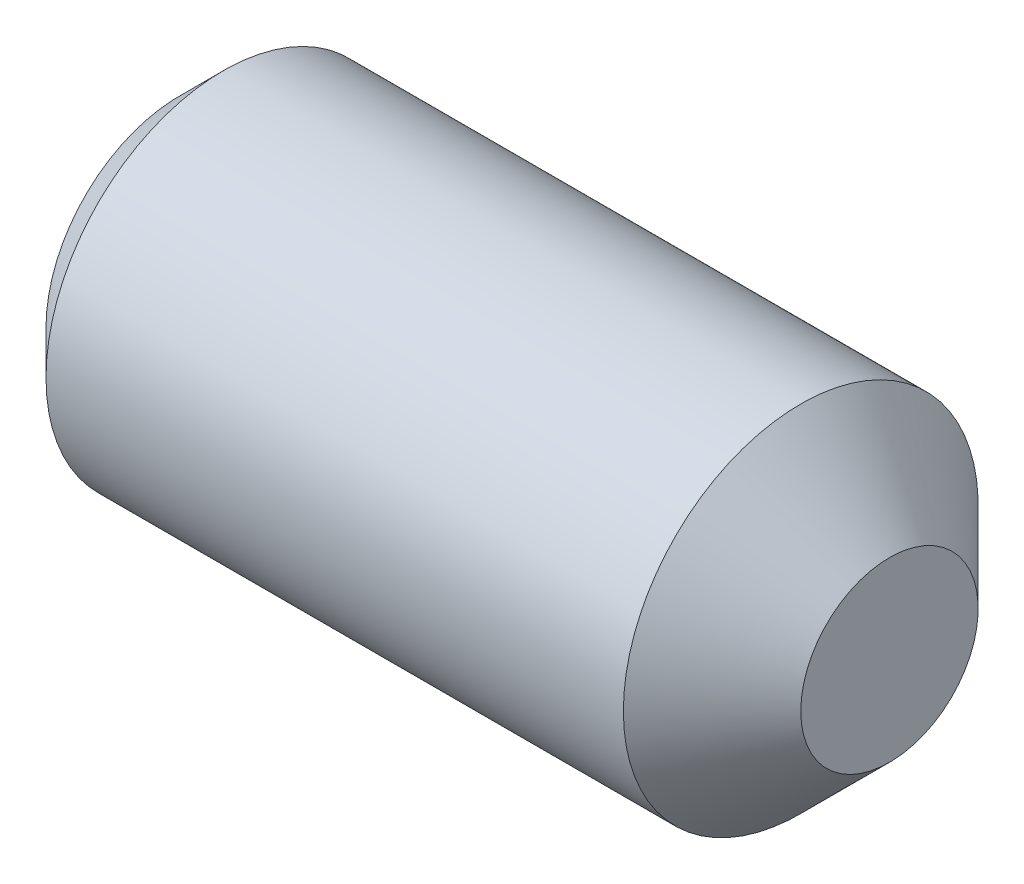
ISO-10303-21;
HEADER;
FILE_DESCRIPTION(('STEP AP214'),'2;1');
FILE_NAME('part.step','',(''),(''),'','','');
FILE_SCHEMA(('AUTOMOTIVE_DESIGN { 1 0 10303 214 1 1 1 1 }'));
ENDSEC;
DATA;
#1=APPLICATION_CONTEXT('core data for automotive mechanical design processes');
#2=APPLICATION_PROTOCOL_DEFINITION('international standard','automotive_design',2000,#1);
#3=PRODUCT_CONTEXT('',#1,'mechanical');
#4=PRODUCT('Part','Part','',(#3));
#5=PRODUCT_RELATED_PRODUCT_CATEGORY('part','',(#4));
#6=PRODUCT_DEFINITION_FORMATION('','',#4);
#7=PRODUCT_DEFINITION_CONTEXT('part definition',#1,'design');
#8=PRODUCT_DEFINITION('design','',#6,#7);
#9=PRODUCT_DEFINITION_SHAPE('','',#8);
#10=(LENGTH_UNIT() NAMED_UNIT(*) SI_UNIT(.MILLI.,.METRE.));
#11=(NAMED_UNIT(*) PLANE_ANGLE_UNIT() SI_UNIT($,.RADIAN.));
#12=(NAMED_UNIT(*) SI_UNIT($,.STERADIAN.) SOLID_ANGLE_UNIT());
#13=UNCERTAINTY_MEASURE_WITH_UNIT(LENGTH_MEASURE(1.E-05),#10,'distance_accuracy_value','');
#14=(GEOMETRIC_REPRESENTATION_CONTEXT(3) GLOBAL_UNCERTAINTY_ASSIGNED_CONTEXT((#13)) GLOBAL_UNIT_ASSIGNED_CONTEXT((#10,
#11,#12)) REPRESENTATION_CONTEXT('',''));
#15=CARTESIAN_POINT('',(0.,0.,0.));
#16=DIRECTION('',(0.,0.,1.));
#17=DIRECTION('',(1.,0.,0.));
#18=AXIS2_PLACEMENT_3D('',#15,#16,#17);
#19=CARTESIAN_POINT('',(-3.2,0.,0.));
#20=DIRECTION('',(-1.,0.,0.));
#21=DIRECTION('',(0.,0.,1.));
#22=AXIS2_PLACEMENT_3D('',#19,#20,#21);
#23=PLANE('',#22);
#24=CARTESIAN_POINT('',(-3.2,0.,0.));
#25=DIRECTION('',(-1.,0.,0.));
#26=DIRECTION('',(0.,0.,1.));
#27=AXIS2_PLACEMENT_3D('',#24,#25,#26);
#28=CIRCLE('',#27,0.45);
#29=CARTESIAN_POINT('',(-3.2,0.224999999999999,0.389711431702998));
#30=VERTEX_POINT('',#29);
#31=CARTESIAN_POINT('',(-3.2,0.45,0.));
#32=VERTEX_POINT('',#31);
#33=EDGE_CURVE('E44',#30,#32,#28,.T.);
#34=ORIENTED_EDGE('',*,*,#33,.F.);
#35=DIRECTION('',(0.,0.86602540378444,-0.499999999999998));
#36=VECTOR('',#35,1.);
#37=CARTESIAN_POINT('',(-3.2,0.,0.51961524227066));
#38=LINE('',#37,#36);
#39=CARTESIAN_POINT('',(-3.2,0.45,0.25980762113533));
#40=VERTEX_POINT('',#39);
#41=EDGE_CURVE('E223',#30,#40,#38,.T.);
#42=ORIENTED_EDGE('',*,*,#41,.T.);
#43=DIRECTION('',(0.,0.,-1.));
#44=VECTOR('',#43,1.);
#45=CARTESIAN_POINT('',(-3.2,0.45,0.25980762113533));
#46=LINE('',#45,#44);
#47=EDGE_CURVE('E216',#40,#32,#46,.T.);
#48=ORIENTED_EDGE('',*,*,#47,.T.);
#49=EDGE_LOOP('',(#34,#42,#48));
#50=FACE_BOUND('',#49,.T.);
#51=ADVANCED_FACE('F33',(#50),#23,.T.);
#52=CARTESIAN_POINT('',(-3.2,0.224999999999999,-0.389711431702998));
#53=VERTEX_POINT('',#52);
#54=EDGE_CURVE('E11',#32,#53,#28,.T.);
#55=ORIENTED_EDGE('',*,*,#54,.F.);
#56=CARTESIAN_POINT('',(-3.2,0.45,-0.25980762113533));
#57=VERTEX_POINT('',#56);
#58=EDGE_CURVE('E219',#32,#57,#46,.T.);
#59=ORIENTED_EDGE('',*,*,#58,.T.);
#60=DIRECTION('',(0.,-0.86602540378444,-0.499999999999998));
#61=VECTOR('',#60,1.);
#62=CARTESIAN_POINT('',(-3.2,0.45,-0.25980762113533));
#63=LINE('',#62,#61);
#64=EDGE_CURVE('E187',#57,#53,#63,.T.);
#65=ORIENTED_EDGE('',*,*,#64,.T.);
#66=EDGE_LOOP('',(#55,#59,#65));
#67=FACE_BOUND('',#66,.T.);
#68=ADVANCED_FACE('F120',(#67),#23,.T.);
#69=CARTESIAN_POINT('',(-3.2,-0.224999999999999,-0.389711431702998));
#70=VERTEX_POINT('',#69);
#71=EDGE_CURVE('E42',#53,#70,#28,.T.);
#72=ORIENTED_EDGE('',*,*,#71,.F.);
#73=CARTESIAN_POINT('',(-3.2,0.,-0.51961524227066));
#74=VERTEX_POINT('',#73);
#75=EDGE_CURVE('E215',#53,#74,#63,.T.);
#76=ORIENTED_EDGE('',*,*,#75,.T.);
#77=DIRECTION('',(0.,-0.86602540378444,0.499999999999998));
#78=VECTOR('',#77,1.);
#79=CARTESIAN_POINT('',(-3.2,0.,-0.51961524227066));
#80=LINE('',#79,#78);
#81=EDGE_CURVE('E232',#74,#70,#80,.T.);
#82=ORIENTED_EDGE('',*,*,#81,.T.);
#83=EDGE_LOOP('',(#72,#76,#82));
#84=FACE_BOUND('',#83,.T.);
#85=ADVANCED_FACE('F125',(#84),#23,.T.);
#86=CARTESIAN_POINT('',(-3.2,-0.45,0.));
#87=VERTEX_POINT('',#86);
#88=EDGE_CURVE('E235',#70,#87,#28,.T.);
#89=ORIENTED_EDGE('',*,*,#88,.F.);
#90=CARTESIAN_POINT('',(-3.2,-0.45,-0.25980762113533));
#91=VERTEX_POINT('',#90);
#92=EDGE_CURVE('E199',#70,#91,#80,.T.);
#93=ORIENTED_EDGE('',*,*,#92,.T.);
#94=DIRECTION('',(0.,0.,1.));
#95=VECTOR('',#94,1.);
#96=CARTESIAN_POINT('',(-3.2,-0.45,-0.25980762113533));
#97=LINE('',#96,#95);
#98=EDGE_CURVE('E228',#91,#87,#97,.T.);
#99=ORIENTED_EDGE('',*,*,#98,.T.);
#100=EDGE_LOOP('',(#89,#93,#99));
#101=FACE_BOUND('',#100,.T.);
#102=ADVANCED_FACE('F242',(#101),#23,.T.);
#103=CARTESIAN_POINT('',(-3.2,-0.224999999999998,0.389711431702996));
#104=VERTEX_POINT('',#103);
#105=EDGE_CURVE('E51',#87,#104,#28,.T.);
#106=ORIENTED_EDGE('',*,*,#105,.F.);
#107=CARTESIAN_POINT('',(-3.2,-0.45,0.25980762113533));
#108=VERTEX_POINT('',#107);
#109=EDGE_CURVE('E231',#87,#108,#97,.T.);
#110=ORIENTED_EDGE('',*,*,#109,.T.);
#111=DIRECTION('',(0.,0.86602540378444,0.499999999999998));
#112=VECTOR('',#111,1.);
#113=CARTESIAN_POINT('',(-3.2,-0.45,0.25980762113533));
#114=LINE('',#113,#112);
#115=EDGE_CURVE('E224',#108,#104,#114,.T.);
#116=ORIENTED_EDGE('',*,*,#115,.T.);
#117=EDGE_LOOP('',(#106,#110,#116));
#118=FACE_BOUND('',#117,.T.);
#119=ADVANCED_FACE('F118',(#118),#23,.T.);
#120=CARTESIAN_POINT('',(-4.,0.,0.));
#121=DIRECTION('',(1.,0.,0.));
#122=DIRECTION('',(0.,0.,-1.));
#123=AXIS2_PLACEMENT_3D('',#120,#121,#122);
#124=PLANE('',#123);
#125=DIRECTION('',(0.,0.,1.));
#126=VECTOR('',#125,1.);
#127=CARTESIAN_POINT('',(-4.,-0.45,-0.25980762113533));
#128=LINE('',#127,#126);
#129=CARTESIAN_POINT('',(-4.,-0.45,-0.25980762113533));
#130=VERTEX_POINT('',#129);
#131=CARTESIAN_POINT('',(-4.,-0.45,0.25980762113533));
#132=VERTEX_POINT('',#131);
#133=EDGE_CURVE('E209',#130,#132,#128,.T.);
#134=ORIENTED_EDGE('',*,*,#133,.F.);
#135=DIRECTION('',(0.,-0.86602540378444,0.499999999999998));
#136=VECTOR('',#135,1.);
#137=CARTESIAN_POINT('',(-4.,0.,-0.51961524227066));
#138=LINE('',#137,#136);
#139=CARTESIAN_POINT('',(-4.,0.,-0.51961524227066));
#140=VERTEX_POINT('',#139);
#141=EDGE_CURVE('E59',#140,#130,#138,.T.);
#142=ORIENTED_EDGE('',*,*,#141,.F.);
#143=DIRECTION('',(0.,-0.86602540378444,-0.499999999999998));
#144=VECTOR('',#143,1.);
#145=CARTESIAN_POINT('',(-4.,0.45,-0.25980762113533));
#146=LINE('',#145,#144);
#147=CARTESIAN_POINT('',(-4.,0.45,-0.25980762113533));
#148=VERTEX_POINT('',#147);
#149=EDGE_CURVE('E196',#148,#140,#146,.T.);
#150=ORIENTED_EDGE('',*,*,#149,.F.);
#151=DIRECTION('',(0.,0.,-1.));
#152=VECTOR('',#151,1.);
#153=CARTESIAN_POINT('',(-4.,0.45,0.25980762113533));
#154=LINE('',#153,#152);
#155=CARTESIAN_POINT('',(-4.,0.45,0.25980762113533));
#156=VERTEX_POINT('',#155);
#157=EDGE_CURVE('E200',#156,#148,#154,.T.);
#158=ORIENTED_EDGE('',*,*,#157,.F.);
#159=DIRECTION('',(0.,0.86602540378444,-0.499999999999998));
#160=VECTOR('',#159,1.);
#161=CARTESIAN_POINT('',(-4.,0.,0.51961524227066));
#162=LINE('',#161,#160);
#163=CARTESIAN_POINT('',(-4.,0.,0.51961524227066));
#164=VERTEX_POINT('',#163);
#165=EDGE_CURVE('E203',#164,#156,#162,.T.);
#166=ORIENTED_EDGE('',*,*,#165,.F.);
#167=DIRECTION('',(0.,0.86602540378444,0.499999999999998));
#168=VECTOR('',#167,1.);
#169=CARTESIAN_POINT('',(-4.,-0.45,0.25980762113533));
#170=LINE('',#169,#168);
#171=EDGE_CURVE('E206',#132,#164,#170,.T.);
#172=ORIENTED_EDGE('',*,*,#171,.F.);
#173=EDGE_LOOP('',(#134,#142,#150,#158,#166,#172));
#174=FACE_BOUND('',#173,.T.);
#175=CARTESIAN_POINT('',(-4.,0.,0.));
#176=DIRECTION('',(-1.,0.,0.));
#177=DIRECTION('',(0.,0.,1.));
#178=AXIS2_PLACEMENT_3D('',#175,#176,#177);
#179=CIRCLE('',#178,0.7545);
#180=CARTESIAN_POINT('',(-4.,0.,0.7545));
#181=VERTEX_POINT('',#180);
#182=EDGE_CURVE('E37',#181,#181,#179,.T.);
#183=ORIENTED_EDGE('',*,*,#182,.T.);
#184=EDGE_LOOP('',(#183));
#185=FACE_BOUND('',#184,.T.);
#186=ADVANCED_FACE('F35',(#174,#185),#124,.F.);
#187=CARTESIAN_POINT('',(-3.7545,0.,0.));
#188=DIRECTION('',(1.,0.,0.));
#189=DIRECTION('',(0.,0.,-1.));
#190=AXIS2_PLACEMENT_3D('',#187,#188,#189);
#191=CONICAL_SURFACE('',#190,1.,0.785398163397448);
#192=ORIENTED_EDGE('',*,*,#182,.F.);
#193=EDGE_LOOP('',(#192));
#194=FACE_BOUND('',#193,.T.);
#195=CARTESIAN_POINT('',(-3.7545,0.,0.));
#196=DIRECTION('',(-1.,0.,0.));
#197=DIRECTION('',(0.,0.,1.));
#198=AXIS2_PLACEMENT_3D('',#195,#196,#197);
#199=CIRCLE('',#198,1.);
#200=CARTESIAN_POINT('',(-3.7545,0.,1.));
#201=VERTEX_POINT('',#200);
#202=EDGE_CURVE('E174',#201,#201,#199,.T.);
#203=ORIENTED_EDGE('',*,*,#202,.T.);
#204=EDGE_LOOP('',(#203));
#205=FACE_BOUND('',#204,.T.);
#206=ADVANCED_FACE('F161',(#194,#205),#191,.T.);
#207=CARTESIAN_POINT('',(0.,0.,0.));
#208=DIRECTION('',(-1.,0.,0.));
#209=DIRECTION('',(0.,0.,1.));
#210=AXIS2_PLACEMENT_3D('',#207,#208,#209);
#211=CYLINDRICAL_SURFACE('',#210,1.);
#212=ORIENTED_EDGE('',*,*,#202,.F.);
#213=EDGE_LOOP('',(#212));
#214=FACE_BOUND('',#213,.T.);
#215=CARTESIAN_POINT('',(-0.5,0.,0.));
#216=DIRECTION('',(-1.,0.,0.));
#217=DIRECTION('',(0.,0.,1.));
#218=AXIS2_PLACEMENT_3D('',#215,#216,#217);
#219=CIRCLE('',#218,1.);
#220=CARTESIAN_POINT('',(-0.5,0.,1.));
#221=VERTEX_POINT('',#220);
#222=EDGE_CURVE('E175',#221,#221,#219,.T.);
#223=ORIENTED_EDGE('',*,*,#222,.T.);
#224=EDGE_LOOP('',(#223));
#225=FACE_BOUND('',#224,.T.);
#226=ADVANCED_FACE('F158',(#214,#225),#211,.T.);
#227=CARTESIAN_POINT('',(0.,0.,0.));
#228=DIRECTION('',(-1.,0.,0.));
#229=DIRECTION('',(0.,0.,1.));
#230=AXIS2_PLACEMENT_3D('',#227,#228,#229);
#231=CONICAL_SURFACE('',#230,0.5,0.785398163397448);
#232=ORIENTED_EDGE('',*,*,#222,.F.);
#233=EDGE_LOOP('',(#232));
#234=FACE_BOUND('',#233,.T.);
#235=CARTESIAN_POINT('',(0.,0.,0.));
#236=DIRECTION('',(-1.,0.,0.));
#237=DIRECTION('',(0.,0.,1.));
#238=AXIS2_PLACEMENT_3D('',#235,#236,#237);
#239=CIRCLE('',#238,0.5);
#240=CARTESIAN_POINT('',(0.,0.,0.5));
#241=VERTEX_POINT('',#240);
#242=EDGE_CURVE('E178',#241,#241,#239,.T.);
#243=ORIENTED_EDGE('',*,*,#242,.T.);
#244=EDGE_LOOP('',(#243));
#245=FACE_BOUND('',#244,.T.);
#246=ADVANCED_FACE('F154',(#234,#245),#231,.T.);
#247=CARTESIAN_POINT('',(0.,0.5,0.));
#248=DIRECTION('',(-1.,0.,0.));
#249=DIRECTION('',(0.,0.,1.));
#250=AXIS2_PLACEMENT_3D('',#247,#248,#249);
#251=PLANE('',#250);
#252=ORIENTED_EDGE('',*,*,#242,.F.);
#253=EDGE_LOOP('',(#252));
#254=FACE_BOUND('',#253,.T.);
#255=ADVANCED_FACE('F151',(#254),#251,.F.);
#256=CARTESIAN_POINT('',(-3.2,0.,-0.51961524227066));
#257=DIRECTION('',(0.,-0.499999999999998,-0.86602540378444));
#258=DIRECTION('',(0.,0.86602540378444,-0.499999999999998));
#259=AXIS2_PLACEMENT_3D('',#256,#257,#258);
#260=PLANE('',#259);
#261=ORIENTED_EDGE('',*,*,#141,.T.);
#262=DIRECTION('',(-1.,0.,0.));
#263=VECTOR('',#262,1.);
#264=CARTESIAN_POINT('',(-3.2,-0.45,-0.25980762113533));
#265=LINE('',#264,#263);
#266=EDGE_CURVE('E184',#91,#130,#265,.T.);
#267=ORIENTED_EDGE('',*,*,#266,.F.);
#268=ORIENTED_EDGE('',*,*,#92,.F.);
#269=ORIENTED_EDGE('',*,*,#81,.F.);
#270=DIRECTION('',(-1.,0.,0.));
#271=VECTOR('',#270,1.);
#272=CARTESIAN_POINT('',(-3.2,0.,-0.51961524227066));
#273=LINE('',#272,#271);
#274=EDGE_CURVE('E183',#74,#140,#273,.T.);
#275=ORIENTED_EDGE('',*,*,#274,.T.);
#276=EDGE_LOOP('',(#261,#267,#268,#269,#275));
#277=FACE_BOUND('',#276,.T.);
#278=ADVANCED_FACE('F133',(#277),#260,.F.);
#279=CARTESIAN_POINT('',(-3.2,0.45,-0.25980762113533));
#280=DIRECTION('',(0.,0.499999999999998,-0.86602540378444));
#281=DIRECTION('',(0.,0.86602540378444,0.499999999999998));
#282=AXIS2_PLACEMENT_3D('',#279,#280,#281);
#283=PLANE('',#282);
#284=ORIENTED_EDGE('',*,*,#149,.T.);
#285=ORIENTED_EDGE('',*,*,#274,.F.);
#286=ORIENTED_EDGE('',*,*,#75,.F.);
#287=ORIENTED_EDGE('',*,*,#64,.F.);
#288=DIRECTION('',(-1.,0.,0.));
#289=VECTOR('',#288,1.);
#290=CARTESIAN_POINT('',(-3.2,0.45,-0.25980762113533));
#291=LINE('',#290,#289);
#292=EDGE_CURVE('E193',#57,#148,#291,.T.);
#293=ORIENTED_EDGE('',*,*,#292,.T.);
#294=EDGE_LOOP('',(#284,#285,#286,#287,#293));
#295=FACE_BOUND('',#294,.T.);
#296=ADVANCED_FACE('F129',(#295),#283,.F.);
#297=CARTESIAN_POINT('',(-3.2,0.45,0.25980762113533));
#298=DIRECTION('',(0.,1.,0.));
#299=DIRECTION('',(0.,0.,1.));
#300=AXIS2_PLACEMENT_3D('',#297,#298,#299);
#301=PLANE('',#300);
#302=ORIENTED_EDGE('',*,*,#157,.T.);
#303=ORIENTED_EDGE('',*,*,#292,.F.);
#304=ORIENTED_EDGE('',*,*,#58,.F.);
#305=ORIENTED_EDGE('',*,*,#47,.F.);
#306=DIRECTION('',(-1.,0.,0.));
#307=VECTOR('',#306,1.);
#308=CARTESIAN_POINT('',(-3.2,0.45,0.25980762113533));
#309=LINE('',#308,#307);
#310=EDGE_CURVE('E191',#40,#156,#309,.T.);
#311=ORIENTED_EDGE('',*,*,#310,.T.);
#312=EDGE_LOOP('',(#302,#303,#304,#305,#311));
#313=FACE_BOUND('',#312,.T.);
#314=ADVANCED_FACE('F132',(#313),#301,.F.);
#315=CARTESIAN_POINT('',(-3.2,0.,0.51961524227066));
#316=DIRECTION('',(0.,0.499999999999998,0.86602540378444));
#317=DIRECTION('',(0.,-0.86602540378444,0.499999999999998));
#318=AXIS2_PLACEMENT_3D('',#315,#316,#317);
#319=PLANE('',#318);
#320=ORIENTED_EDGE('',*,*,#165,.T.);
#321=ORIENTED_EDGE('',*,*,#310,.F.);
#322=ORIENTED_EDGE('',*,*,#41,.F.);
#323=CARTESIAN_POINT('',(-3.2,0.,0.51961524227066));
#324=VERTEX_POINT('',#323);
#325=EDGE_CURVE('E220',#324,#30,#38,.T.);
#326=ORIENTED_EDGE('',*,*,#325,.F.);
#327=DIRECTION('',(-1.,0.,0.));
#328=VECTOR('',#327,1.);
#329=CARTESIAN_POINT('',(-3.2,0.,0.51961524227066));
#330=LINE('',#329,#328);
#331=EDGE_CURVE('E189',#324,#164,#330,.T.);
#332=ORIENTED_EDGE('',*,*,#331,.T.);
#333=EDGE_LOOP('',(#320,#321,#322,#326,#332));
#334=FACE_BOUND('',#333,.T.);
#335=ADVANCED_FACE('F137',(#334),#319,.F.);
#336=CARTESIAN_POINT('',(-3.2,-0.45,0.25980762113533));
#337=DIRECTION('',(0.,-0.499999999999998,0.86602540378444));
#338=DIRECTION('',(0.,-0.86602540378444,-0.499999999999998));
#339=AXIS2_PLACEMENT_3D('',#336,#337,#338);
#340=PLANE('',#339);
#341=ORIENTED_EDGE('',*,*,#171,.T.);
#342=ORIENTED_EDGE('',*,*,#331,.F.);
#343=EDGE_CURVE('E227',#104,#324,#114,.T.);
#344=ORIENTED_EDGE('',*,*,#343,.F.);
#345=ORIENTED_EDGE('',*,*,#115,.F.);
#346=DIRECTION('',(-1.,0.,0.));
#347=VECTOR('',#346,1.);
#348=CARTESIAN_POINT('',(-3.2,-0.45,0.25980762113533));
#349=LINE('',#348,#347);
#350=EDGE_CURVE('E186',#108,#132,#349,.T.);
#351=ORIENTED_EDGE('',*,*,#350,.T.);
#352=EDGE_LOOP('',(#341,#342,#344,#345,#351));
#353=FACE_BOUND('',#352,.T.);
#354=ADVANCED_FACE('F141',(#353),#340,.F.);
#355=CARTESIAN_POINT('',(-3.2,-0.45,-0.25980762113533));
#356=DIRECTION('',(0.,-1.,0.));
#357=DIRECTION('',(0.,0.,-1.));
#358=AXIS2_PLACEMENT_3D('',#355,#356,#357);
#359=PLANE('',#358);
#360=ORIENTED_EDGE('',*,*,#133,.T.);
#361=ORIENTED_EDGE('',*,*,#350,.F.);
#362=ORIENTED_EDGE('',*,*,#109,.F.);
#363=ORIENTED_EDGE('',*,*,#98,.F.);
#364=ORIENTED_EDGE('',*,*,#266,.T.);
#365=EDGE_LOOP('',(#360,#361,#362,#363,#364));
#366=FACE_BOUND('',#365,.T.);
#367=ADVANCED_FACE('F115',(#366),#359,.F.);
#368=EDGE_CURVE('E176',#104,#30,#28,.T.);
#369=ORIENTED_EDGE('',*,*,#368,.F.);
#370=ORIENTED_EDGE('',*,*,#343,.T.);
#371=ORIENTED_EDGE('',*,*,#325,.T.);
#372=EDGE_LOOP('',(#369,#370,#371));
#373=FACE_BOUND('',#372,.T.);
#374=ADVANCED_FACE('F110',(#373),#23,.T.);
#375=CARTESIAN_POINT('',(-2.9401923788647,0.,0.));
#376=DIRECTION('',(-1.,0.,0.));
#377=DIRECTION('',(0.,0.,1.));
#378=AXIS2_PLACEMENT_3D('',#375,#376,#377);
#379=CONICAL_SURFACE('',#378,0.,1.04719755119665);
#380=ORIENTED_EDGE('',*,*,#33,.T.);
#381=ORIENTED_EDGE('',*,*,#54,.T.);
#382=ORIENTED_EDGE('',*,*,#71,.T.);
#383=ORIENTED_EDGE('',*,*,#88,.T.);
#384=ORIENTED_EDGE('',*,*,#105,.T.);
#385=ORIENTED_EDGE('',*,*,#368,.T.);
#386=EDGE_LOOP('',(#380,#381,#382,#383,#384,#385));
#387=FACE_BOUND('',#386,.T.);
#388=CARTESIAN_POINT('',(-2.9401923788647,0.,0.));
#389=VERTEX_POINT('',#388);
#390=VERTEX_LOOP('',#389);
#391=FACE_BOUND('',#390,.T.);
#392=ADVANCED_FACE('F108',(#387,#391),#379,.F.);
#393=CLOSED_SHELL('',(#51,#68,#85,#102,#119,#186,#206,#226,#246,#255,#278,#296,#314,#335,#354,
#367,#374,#392));
#394=MANIFOLD_SOLID_BREP('B2',#393);
#395=ADVANCED_BREP_SHAPE_REPRESENTATION('',(#18,#394),#14);
#396=SHAPE_DEFINITION_REPRESENTATION(#9,#395);
ENDSEC;
END-ISO-10303-21;
